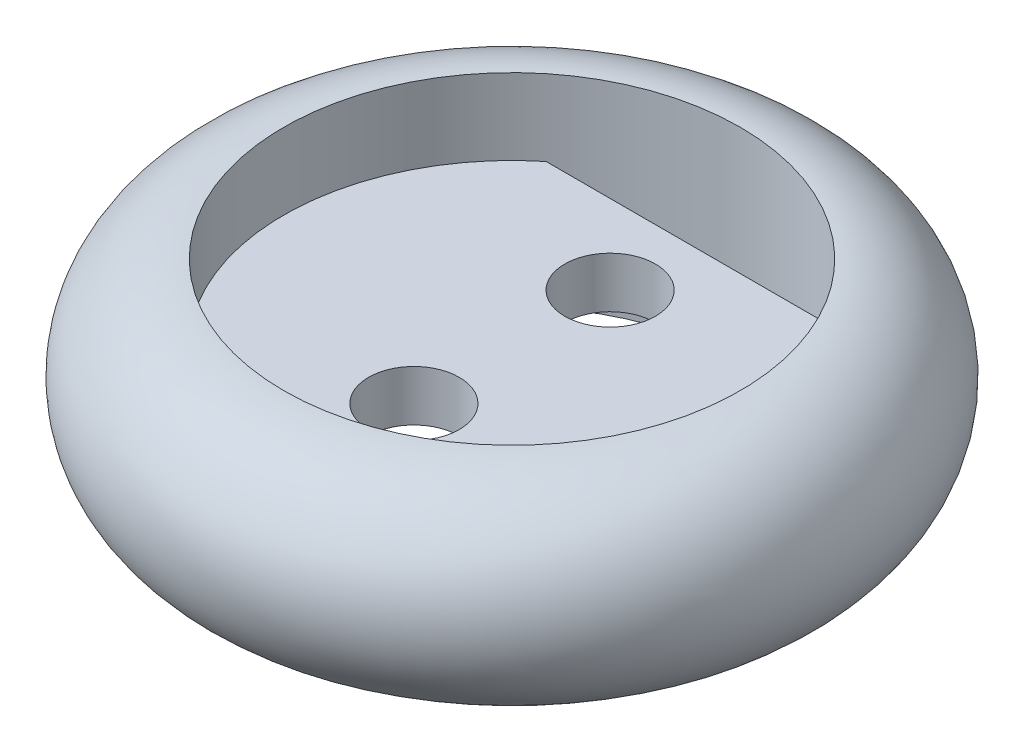
ISO-10303-21;
HEADER;
FILE_DESCRIPTION(('STEP AP214'),'2;1');
FILE_NAME('part.step','',(''),(''),'','','');
FILE_SCHEMA(('AUTOMOTIVE_DESIGN { 1 0 10303 214 1 1 1 1 }'));
ENDSEC;
DATA;
#1=APPLICATION_CONTEXT('core data for automotive mechanical design processes');
#2=APPLICATION_PROTOCOL_DEFINITION('international standard','automotive_design',2000,#1);
#3=PRODUCT_CONTEXT('',#1,'mechanical');
#4=PRODUCT('Part','Part','',(#3));
#5=PRODUCT_RELATED_PRODUCT_CATEGORY('part','',(#4));
#6=PRODUCT_DEFINITION_FORMATION('','',#4);
#7=PRODUCT_DEFINITION_CONTEXT('part definition',#1,'design');
#8=PRODUCT_DEFINITION('design','',#6,#7);
#9=PRODUCT_DEFINITION_SHAPE('','',#8);
#10=(LENGTH_UNIT() NAMED_UNIT(*) SI_UNIT(.MILLI.,.METRE.));
#11=(NAMED_UNIT(*) PLANE_ANGLE_UNIT() SI_UNIT($,.RADIAN.));
#12=(NAMED_UNIT(*) SI_UNIT($,.STERADIAN.) SOLID_ANGLE_UNIT());
#13=UNCERTAINTY_MEASURE_WITH_UNIT(LENGTH_MEASURE(1.E-05),#10,'distance_accuracy_value','');
#14=(GEOMETRIC_REPRESENTATION_CONTEXT(3) GLOBAL_UNCERTAINTY_ASSIGNED_CONTEXT((#13)) GLOBAL_UNIT_ASSIGNED_CONTEXT((#10,
#11,#12)) REPRESENTATION_CONTEXT('',''));
#15=CARTESIAN_POINT('',(0.,0.,0.));
#16=DIRECTION('',(0.,0.,1.));
#17=DIRECTION('',(1.,0.,0.));
#18=AXIS2_PLACEMENT_3D('',#15,#16,#17);
#19=CARTESIAN_POINT('',(0.,5.,0.));
#20=DIRECTION('',(0.,1.,0.));
#21=DIRECTION('',(0.,0.,1.));
#22=AXIS2_PLACEMENT_3D('',#19,#20,#21);
#23=TOROIDAL_SURFACE('',#22,45.,20.);
#24=CARTESIAN_POINT('',(0.,25.,0.));
#25=DIRECTION('',(0.,1.,0.));
#26=DIRECTION('',(0.,0.,1.));
#27=AXIS2_PLACEMENT_3D('',#24,#25,#26);
#28=CIRCLE('',#27,45.);
#29=CARTESIAN_POINT('',(0.,25.,45.));
#30=VERTEX_POINT('',#29);
#31=EDGE_CURVE('E102',#30,#30,#28,.T.);
#32=ORIENTED_EDGE('',*,*,#31,.F.);
#33=EDGE_LOOP('',(#32));
#34=FACE_BOUND('',#33,.T.);
#35=CARTESIAN_POINT('',(0.,-15.,0.));
#36=DIRECTION('',(0.,1.,0.));
#37=DIRECTION('',(0.,0.,1.));
#38=AXIS2_PLACEMENT_3D('',#35,#36,#37);
#39=CIRCLE('',#38,45.);
#40=CARTESIAN_POINT('',(0.,-15.,45.));
#41=VERTEX_POINT('',#40);
#42=EDGE_CURVE('E153',#41,#41,#39,.T.);
#43=ORIENTED_EDGE('',*,*,#42,.T.);
#44=EDGE_LOOP('',(#43));
#45=FACE_BOUND('',#44,.T.);
#46=ADVANCED_FACE('F43',(#34,#45),#23,.T.);
#47=CARTESIAN_POINT('',(0.,30.8337629915063,0.));
#48=DIRECTION('',(0.,1.,0.));
#49=DIRECTION('',(0.,0.,1.));
#50=AXIS2_PLACEMENT_3D('',#47,#48,#49);
#51=CYLINDRICAL_SURFACE('',#50,45.);
#52=CARTESIAN_POINT('',(0.,10.,0.));
#53=DIRECTION('',(0.,1.,0.));
#54=DIRECTION('',(0.,0.,1.));
#55=AXIS2_PLACEMENT_3D('',#52,#53,#54);
#56=CIRCLE('',#55,45.);
#57=CARTESIAN_POINT('',(28.2842712474619,10.,35.));
#58=VERTEX_POINT('',#57);
#59=CARTESIAN_POINT('',(28.2842712474619,10.,-35.));
#60=VERTEX_POINT('',#59);
#61=EDGE_CURVE('E59',#58,#60,#56,.T.);
#62=ORIENTED_EDGE('',*,*,#61,.F.);
#63=DIRECTION('',(0.,1.,0.));
#64=VECTOR('',#63,1.);
#65=CARTESIAN_POINT('',(28.2842712474619,30.8337629915063,35.));
#66=LINE('',#65,#64);
#67=CARTESIAN_POINT('',(28.2842712474619,0.,35.));
#68=VERTEX_POINT('',#67);
#69=EDGE_CURVE('E144',#58,#68,#66,.F.);
#70=ORIENTED_EDGE('',*,*,#69,.T.);
#71=CARTESIAN_POINT('',(0.,0.,0.));
#72=DIRECTION('',(0.,1.,0.));
#73=DIRECTION('',(0.,0.,1.));
#74=AXIS2_PLACEMENT_3D('',#71,#72,#73);
#75=CIRCLE('',#74,45.);
#76=CARTESIAN_POINT('',(28.2842712474619,0.,-35.));
#77=VERTEX_POINT('',#76);
#78=EDGE_CURVE('E11',#68,#77,#75,.T.);
#79=ORIENTED_EDGE('',*,*,#78,.T.);
#80=DIRECTION('',(0.,1.,0.));
#81=VECTOR('',#80,1.);
#82=CARTESIAN_POINT('',(28.2842712474619,30.8337629915063,-35.));
#83=LINE('',#82,#81);
#84=EDGE_CURVE('E130',#77,#60,#83,.T.);
#85=ORIENTED_EDGE('',*,*,#84,.T.);
#86=EDGE_LOOP('',(#62,#70,#79,#85));
#87=FACE_BOUND('',#86,.T.);
#88=CARTESIAN_POINT('',(-28.2842712474619,10.,-35.));
#89=VERTEX_POINT('',#88);
#90=CARTESIAN_POINT('',(-28.2842712474619,10.,35.));
#91=VERTEX_POINT('',#90);
#92=EDGE_CURVE('E67',#89,#91,#56,.T.);
#93=ORIENTED_EDGE('',*,*,#92,.F.);
#94=DIRECTION('',(0.,1.,0.));
#95=VECTOR('',#94,1.);
#96=CARTESIAN_POINT('',(-28.2842712474619,30.8337629915063,-35.));
#97=LINE('',#96,#95);
#98=CARTESIAN_POINT('',(-28.2842712474619,0.,-35.));
#99=VERTEX_POINT('',#98);
#100=EDGE_CURVE('E101',#89,#99,#97,.F.);
#101=ORIENTED_EDGE('',*,*,#100,.T.);
#102=CARTESIAN_POINT('',(-28.2842712474619,0.,35.));
#103=VERTEX_POINT('',#102);
#104=EDGE_CURVE('E47',#99,#103,#75,.T.);
#105=ORIENTED_EDGE('',*,*,#104,.T.);
#106=DIRECTION('',(0.,1.,0.));
#107=VECTOR('',#106,1.);
#108=CARTESIAN_POINT('',(-28.2842712474619,30.8337629915063,35.));
#109=LINE('',#108,#107);
#110=EDGE_CURVE('E96',#103,#91,#109,.T.);
#111=ORIENTED_EDGE('',*,*,#110,.T.);
#112=EDGE_LOOP('',(#93,#101,#105,#111));
#113=FACE_BOUND('',#112,.T.);
#114=ORIENTED_EDGE('',*,*,#42,.F.);
#115=EDGE_LOOP('',(#114));
#116=FACE_BOUND('',#115,.T.);
#117=ORIENTED_EDGE('',*,*,#31,.T.);
#118=EDGE_LOOP('',(#117));
#119=FACE_BOUND('',#118,.T.);
#120=ADVANCED_FACE('F105',(#87,#113,#116,#119),#51,.F.);
#121=CARTESIAN_POINT('',(-45.,10.,-35.));
#122=DIRECTION('',(0.,0.,1.));
#123=DIRECTION('',(1.,0.,0.));
#124=AXIS2_PLACEMENT_3D('',#121,#122,#123);
#125=PLANE('',#124);
#126=ORIENTED_EDGE('',*,*,#84,.F.);
#127=DIRECTION('',(-1.,0.,0.));
#128=VECTOR('',#127,1.);
#129=CARTESIAN_POINT('',(-45.,0.,-35.));
#130=LINE('',#129,#128);
#131=EDGE_CURVE('E94',#77,#99,#130,.T.);
#132=ORIENTED_EDGE('',*,*,#131,.T.);
#133=ORIENTED_EDGE('',*,*,#100,.F.);
#134=DIRECTION('',(-1.,0.,0.));
#135=VECTOR('',#134,1.);
#136=CARTESIAN_POINT('',(-45.,10.,-35.));
#137=LINE('',#136,#135);
#138=EDGE_CURVE('E93',#60,#89,#137,.T.);
#139=ORIENTED_EDGE('',*,*,#138,.F.);
#140=EDGE_LOOP('',(#126,#132,#133,#139));
#141=FACE_BOUND('',#140,.T.);
#142=ADVANCED_FACE('F45',(#141),#125,.F.);
#143=CARTESIAN_POINT('',(-45.,10.,35.));
#144=DIRECTION('',(0.,0.,-1.));
#145=DIRECTION('',(-1.,0.,0.));
#146=AXIS2_PLACEMENT_3D('',#143,#144,#145);
#147=PLANE('',#146);
#148=ORIENTED_EDGE('',*,*,#110,.F.);
#149=DIRECTION('',(1.,0.,0.));
#150=VECTOR('',#149,1.);
#151=CARTESIAN_POINT('',(-45.,0.,35.));
#152=LINE('',#151,#150);
#153=EDGE_CURVE('E86',#103,#68,#152,.T.);
#154=ORIENTED_EDGE('',*,*,#153,.T.);
#155=ORIENTED_EDGE('',*,*,#69,.F.);
#156=DIRECTION('',(1.,0.,0.));
#157=VECTOR('',#156,1.);
#158=CARTESIAN_POINT('',(-45.,10.,35.));
#159=LINE('',#158,#157);
#160=EDGE_CURVE('E98',#91,#58,#159,.T.);
#161=ORIENTED_EDGE('',*,*,#160,.F.);
#162=EDGE_LOOP('',(#148,#154,#155,#161));
#163=FACE_BOUND('',#162,.T.);
#164=ADVANCED_FACE('F97',(#163),#147,.F.);
#165=CARTESIAN_POINT('',(0.,10.,0.));
#166=DIRECTION('',(0.,1.,0.));
#167=DIRECTION('',(0.,0.,1.));
#168=AXIS2_PLACEMENT_3D('',#165,#166,#167);
#169=PLANE('',#168);
#170=CARTESIAN_POINT('',(0.,10.,-19.3451707928927));
#171=DIRECTION('',(0.,1.,0.));
#172=DIRECTION('',(0.,0.,1.));
#173=AXIS2_PLACEMENT_3D('',#170,#171,#172);
#174=CIRCLE('',#173,8.93564479107505);
#175=CARTESIAN_POINT('',(0.,10.,-10.4095260018177));
#176=VERTEX_POINT('',#175);
#177=EDGE_CURVE('E121',#176,#176,#174,.T.);
#178=ORIENTED_EDGE('',*,*,#177,.F.);
#179=EDGE_LOOP('',(#178));
#180=FACE_BOUND('',#179,.T.);
#181=CARTESIAN_POINT('',(0.,10.,19.3451707928927));
#182=DIRECTION('',(0.,1.,0.));
#183=DIRECTION('',(0.,0.,-1.));
#184=AXIS2_PLACEMENT_3D('',#181,#182,#183);
#185=CIRCLE('',#184,8.93564479107505);
#186=CARTESIAN_POINT('',(0.,10.,10.4095260018177));
#187=VERTEX_POINT('',#186);
#188=EDGE_CURVE('E127',#187,#187,#185,.T.);
#189=ORIENTED_EDGE('',*,*,#188,.F.);
#190=EDGE_LOOP('',(#189));
#191=FACE_BOUND('',#190,.T.);
#192=ORIENTED_EDGE('',*,*,#160,.T.);
#193=ORIENTED_EDGE('',*,*,#61,.T.);
#194=ORIENTED_EDGE('',*,*,#138,.T.);
#195=ORIENTED_EDGE('',*,*,#92,.T.);
#196=EDGE_LOOP('',(#192,#193,#194,#195));
#197=FACE_BOUND('',#196,.T.);
#198=ADVANCED_FACE('F176',(#180,#191,#197),#169,.T.);
#199=CARTESIAN_POINT('',(0.,0.,0.));
#200=DIRECTION('',(0.,1.,0.));
#201=DIRECTION('',(0.,0.,1.));
#202=AXIS2_PLACEMENT_3D('',#199,#200,#201);
#203=PLANE('',#202);
#204=CARTESIAN_POINT('',(0.,0.,-19.3451707928927));
#205=DIRECTION('',(0.,1.,0.));
#206=DIRECTION('',(0.,0.,1.));
#207=AXIS2_PLACEMENT_3D('',#204,#205,#206);
#208=CIRCLE('',#207,8.93564479107505);
#209=CARTESIAN_POINT('',(0.,0.,-10.4095260018177));
#210=VERTEX_POINT('',#209);
#211=EDGE_CURVE('E116',#210,#210,#208,.T.);
#212=ORIENTED_EDGE('',*,*,#211,.T.);
#213=EDGE_LOOP('',(#212));
#214=FACE_BOUND('',#213,.T.);
#215=CARTESIAN_POINT('',(0.,0.,19.3451707928927));
#216=DIRECTION('',(0.,1.,0.));
#217=DIRECTION('',(0.,0.,-1.));
#218=AXIS2_PLACEMENT_3D('',#215,#216,#217);
#219=CIRCLE('',#218,8.93564479107505);
#220=CARTESIAN_POINT('',(0.,0.,10.4095260018177));
#221=VERTEX_POINT('',#220);
#222=EDGE_CURVE('E135',#221,#221,#219,.T.);
#223=ORIENTED_EDGE('',*,*,#222,.T.);
#224=EDGE_LOOP('',(#223));
#225=FACE_BOUND('',#224,.T.);
#226=ORIENTED_EDGE('',*,*,#78,.F.);
#227=ORIENTED_EDGE('',*,*,#153,.F.);
#228=ORIENTED_EDGE('',*,*,#104,.F.);
#229=ORIENTED_EDGE('',*,*,#131,.F.);
#230=EDGE_LOOP('',(#226,#227,#228,#229));
#231=FACE_BOUND('',#230,.T.);
#232=ADVANCED_FACE('F88',(#214,#225,#231),#203,.F.);
#233=CARTESIAN_POINT('',(0.,0.,19.3451707928927));
#234=DIRECTION('',(0.,1.,0.));
#235=DIRECTION('',(0.,0.,1.));
#236=AXIS2_PLACEMENT_3D('',#233,#234,#235);
#237=CYLINDRICAL_SURFACE('',#236,8.93564479107505);
#238=ORIENTED_EDGE('',*,*,#222,.F.);
#239=EDGE_LOOP('',(#238));
#240=FACE_BOUND('',#239,.T.);
#241=ORIENTED_EDGE('',*,*,#188,.T.);
#242=EDGE_LOOP('',(#241));
#243=FACE_BOUND('',#242,.T.);
#244=ADVANCED_FACE('F171',(#240,#243),#237,.F.);
#245=CARTESIAN_POINT('',(0.,0.,-19.3451707928927));
#246=DIRECTION('',(0.,1.,0.));
#247=DIRECTION('',(0.,0.,1.));
#248=AXIS2_PLACEMENT_3D('',#245,#246,#247);
#249=CYLINDRICAL_SURFACE('',#248,8.93564479107505);
#250=ORIENTED_EDGE('',*,*,#211,.F.);
#251=EDGE_LOOP('',(#250));
#252=FACE_BOUND('',#251,.T.);
#253=ORIENTED_EDGE('',*,*,#177,.T.);
#254=EDGE_LOOP('',(#253));
#255=FACE_BOUND('',#254,.T.);
#256=ADVANCED_FACE('F168',(#252,#255),#249,.F.);
#257=CLOSED_SHELL('',(#46,#120,#142,#164,#198,#232,#244,#256));
#258=MANIFOLD_SOLID_BREP('B2',#257);
#259=ADVANCED_BREP_SHAPE_REPRESENTATION('',(#18,#258),#14);
#260=SHAPE_DEFINITION_REPRESENTATION(#9,#259);
ENDSEC;
END-ISO-10303-21;
